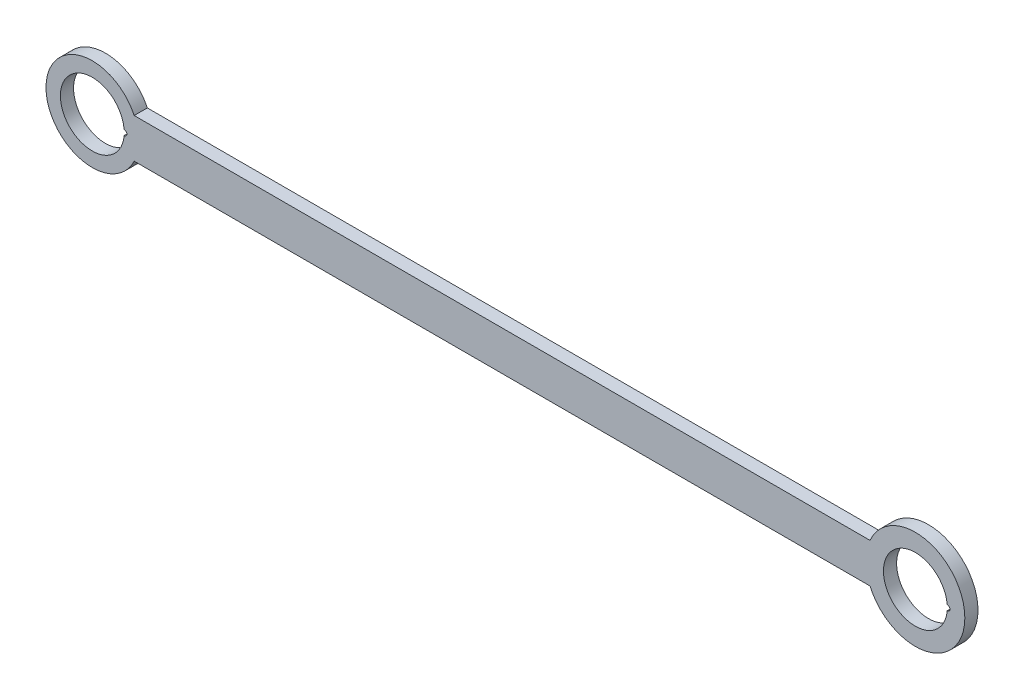
ISO-10303-21;
HEADER;
FILE_DESCRIPTION(('STEP AP214'),'2;1');
FILE_NAME('part.step','',(''),(''),'','','');
FILE_SCHEMA(('AUTOMOTIVE_DESIGN { 1 0 10303 214 1 1 1 1 }'));
ENDSEC;
DATA;
#1=APPLICATION_CONTEXT('core data for automotive mechanical design processes');
#2=APPLICATION_PROTOCOL_DEFINITION('international standard','automotive_design',2000,#1);
#3=PRODUCT_CONTEXT('',#1,'mechanical');
#4=PRODUCT('Part','Part','',(#3));
#5=PRODUCT_RELATED_PRODUCT_CATEGORY('part','',(#4));
#6=PRODUCT_DEFINITION_FORMATION('','',#4);
#7=PRODUCT_DEFINITION_CONTEXT('part definition',#1,'design');
#8=PRODUCT_DEFINITION('design','',#6,#7);
#9=PRODUCT_DEFINITION_SHAPE('','',#8);
#10=(LENGTH_UNIT() NAMED_UNIT(*) SI_UNIT(.MILLI.,.METRE.));
#11=(NAMED_UNIT(*) PLANE_ANGLE_UNIT() SI_UNIT($,.RADIAN.));
#12=(NAMED_UNIT(*) SI_UNIT($,.STERADIAN.) SOLID_ANGLE_UNIT());
#13=UNCERTAINTY_MEASURE_WITH_UNIT(LENGTH_MEASURE(1.E-05),#10,'distance_accuracy_value','');
#14=(GEOMETRIC_REPRESENTATION_CONTEXT(3) GLOBAL_UNCERTAINTY_ASSIGNED_CONTEXT((#13)) GLOBAL_UNIT_ASSIGNED_CONTEXT((#10,
#11,#12)) REPRESENTATION_CONTEXT('',''));
#15=CARTESIAN_POINT('',(0.,0.,0.));
#16=DIRECTION('',(0.,0.,1.));
#17=DIRECTION('',(1.,0.,0.));
#18=AXIS2_PLACEMENT_3D('',#15,#16,#17);
#19=CARTESIAN_POINT('',(0.,0.,4.));
#20=DIRECTION('',(0.,0.,-1.));
#21=DIRECTION('',(-1.,0.,0.));
#22=AXIS2_PLACEMENT_3D('',#19,#20,#21);
#23=PLANE('',#22);
#24=CARTESIAN_POINT('',(0.,0.,4.));
#25=DIRECTION('',(0.,0.,1.));
#26=DIRECTION('',(-1.,0.,0.));
#27=AXIS2_PLACEMENT_3D('',#24,#25,#26);
#28=CIRCLE('',#27,14.0628919691904);
#29=CARTESIAN_POINT('',(12.718684308415,6.,4.));
#30=VERTEX_POINT('',#29);
#31=CARTESIAN_POINT('',(12.718684308415,-6.,4.));
#32=VERTEX_POINT('',#31);
#33=EDGE_CURVE('E137',#30,#32,#28,.T.);
#34=ORIENTED_EDGE('',*,*,#33,.T.);
#35=DIRECTION('',(1.,0.,0.));
#36=VECTOR('',#35,1.);
#37=CARTESIAN_POINT('',(12.718684308415,-6.,4.));
#38=LINE('',#37,#36);
#39=CARTESIAN_POINT('',(236.224480752541,-5.99999999999999,4.));
#40=VERTEX_POINT('',#39);
#41=EDGE_CURVE('E141',#32,#40,#38,.T.);
#42=ORIENTED_EDGE('',*,*,#41,.T.);
#43=CARTESIAN_POINT('',(250.,0.,4.));
#44=DIRECTION('',(0.,0.,1.));
#45=DIRECTION('',(1.,0.,0.));
#46=AXIS2_PLACEMENT_3D('',#43,#44,#45);
#47=CIRCLE('',#46,15.0254760502661);
#48=CARTESIAN_POINT('',(236.224480752541,6.,4.));
#49=VERTEX_POINT('',#48);
#50=EDGE_CURVE('E145',#40,#49,#47,.T.);
#51=ORIENTED_EDGE('',*,*,#50,.T.);
#52=DIRECTION('',(-1.,0.,0.));
#53=VECTOR('',#52,1.);
#54=CARTESIAN_POINT('',(12.718684308415,6.,4.));
#55=LINE('',#54,#53);
#56=EDGE_CURVE('E148',#49,#30,#55,.T.);
#57=ORIENTED_EDGE('',*,*,#56,.T.);
#58=EDGE_LOOP('',(#34,#42,#51,#57));
#59=FACE_BOUND('',#58,.T.);
#60=CARTESIAN_POINT('',(0.,0.,4.));
#61=DIRECTION('',(0.,0.,1.));
#62=DIRECTION('',(1.,0.,0.));
#63=AXIS2_PLACEMENT_3D('',#60,#61,#62);
#64=CIRCLE('',#63,9.7);
#65=CARTESIAN_POINT('',(9.66701030927835,0.799319510775317,4.));
#66=VERTEX_POINT('',#65);
#67=CARTESIAN_POINT('',(9.66701030927835,-0.799319510775317,4.));
#68=VERTEX_POINT('',#67);
#69=EDGE_CURVE('E126',#66,#68,#64,.T.);
#70=ORIENTED_EDGE('',*,*,#69,.F.);
#71=CARTESIAN_POINT('',(9.7,0.,4.));
#72=DIRECTION('',(0.,0.,1.));
#73=DIRECTION('',(1.,0.,0.));
#74=AXIS2_PLACEMENT_3D('',#71,#72,#73);
#75=CIRCLE('',#74,0.800000000000001);
#76=EDGE_CURVE('E54',#68,#66,#75,.T.);
#77=ORIENTED_EDGE('',*,*,#76,.F.);
#78=EDGE_LOOP('',(#70,#77));
#79=FACE_BOUND('',#78,.T.);
#80=CARTESIAN_POINT('',(250.,0.,4.));
#81=DIRECTION('',(0.,0.,1.));
#82=DIRECTION('',(1.,0.,0.));
#83=AXIS2_PLACEMENT_3D('',#80,#81,#82);
#84=CIRCLE('',#83,9.7);
#85=CARTESIAN_POINT('',(259.667010309278,0.799319510775326,4.));
#86=VERTEX_POINT('',#85);
#87=CARTESIAN_POINT('',(259.667010309278,-0.799319510775327,4.));
#88=VERTEX_POINT('',#87);
#89=EDGE_CURVE('E115',#86,#88,#84,.T.);
#90=ORIENTED_EDGE('',*,*,#89,.F.);
#91=CARTESIAN_POINT('',(259.7,0.,4.));
#92=DIRECTION('',(0.,0.,1.));
#93=DIRECTION('',(1.,0.,0.));
#94=AXIS2_PLACEMENT_3D('',#91,#92,#93);
#95=CIRCLE('',#94,0.800000000000011);
#96=EDGE_CURVE('E62',#88,#86,#95,.T.);
#97=ORIENTED_EDGE('',*,*,#96,.F.);
#98=EDGE_LOOP('',(#90,#97));
#99=FACE_BOUND('',#98,.T.);
#100=ADVANCED_FACE('F39',(#59,#79,#99),#23,.F.);
#101=CARTESIAN_POINT('',(0.,0.,0.));
#102=DIRECTION('',(0.,0.,-1.));
#103=DIRECTION('',(-1.,0.,0.));
#104=AXIS2_PLACEMENT_3D('',#101,#102,#103);
#105=PLANE('',#104);
#106=CARTESIAN_POINT('',(9.7,0.,0.));
#107=DIRECTION('',(0.,0.,-1.));
#108=DIRECTION('',(-1.,0.,0.));
#109=AXIS2_PLACEMENT_3D('',#106,#107,#108);
#110=CIRCLE('',#109,0.800000000000001);
#111=CARTESIAN_POINT('',(9.66701030927835,0.799319510775316,0.));
#112=VERTEX_POINT('',#111);
#113=CARTESIAN_POINT('',(9.66701030927835,-0.79931951077531,0.));
#114=VERTEX_POINT('',#113);
#115=EDGE_CURVE('E128',#112,#114,#110,.T.);
#116=ORIENTED_EDGE('',*,*,#115,.F.);
#117=CARTESIAN_POINT('',(0.,0.,0.));
#118=DIRECTION('',(0.,0.,1.));
#119=DIRECTION('',(1.,0.,0.));
#120=AXIS2_PLACEMENT_3D('',#117,#118,#119);
#121=CIRCLE('',#120,9.7);
#122=EDGE_CURVE('E120',#112,#114,#121,.T.);
#123=ORIENTED_EDGE('',*,*,#122,.T.);
#124=EDGE_LOOP('',(#116,#123));
#125=FACE_BOUND('',#124,.T.);
#126=CARTESIAN_POINT('',(259.7,0.,0.));
#127=DIRECTION('',(0.,0.,-1.));
#128=DIRECTION('',(-1.,0.,0.));
#129=AXIS2_PLACEMENT_3D('',#126,#127,#128);
#130=CIRCLE('',#129,0.800000000000011);
#131=CARTESIAN_POINT('',(259.667010309278,0.799319510775328,0.));
#132=VERTEX_POINT('',#131);
#133=CARTESIAN_POINT('',(259.667010309278,-0.799319510775326,0.));
#134=VERTEX_POINT('',#133);
#135=EDGE_CURVE('E105',#132,#134,#130,.T.);
#136=ORIENTED_EDGE('',*,*,#135,.F.);
#137=CARTESIAN_POINT('',(250.,0.,0.));
#138=DIRECTION('',(0.,0.,1.));
#139=DIRECTION('',(1.,0.,0.));
#140=AXIS2_PLACEMENT_3D('',#137,#138,#139);
#141=CIRCLE('',#140,9.7);
#142=EDGE_CURVE('E121',#132,#134,#141,.T.);
#143=ORIENTED_EDGE('',*,*,#142,.T.);
#144=EDGE_LOOP('',(#136,#143));
#145=FACE_BOUND('',#144,.T.);
#146=CARTESIAN_POINT('',(0.,0.,0.));
#147=DIRECTION('',(0.,0.,1.));
#148=DIRECTION('',(-1.,0.,0.));
#149=AXIS2_PLACEMENT_3D('',#146,#147,#148);
#150=CIRCLE('',#149,14.0628919691904);
#151=CARTESIAN_POINT('',(12.718684308415,6.,0.));
#152=VERTEX_POINT('',#151);
#153=CARTESIAN_POINT('',(12.718684308415,-6.,0.));
#154=VERTEX_POINT('',#153);
#155=EDGE_CURVE('E135',#152,#154,#150,.T.);
#156=ORIENTED_EDGE('',*,*,#155,.F.);
#157=DIRECTION('',(-1.,0.,0.));
#158=VECTOR('',#157,1.);
#159=CARTESIAN_POINT('',(12.718684308415,6.,0.));
#160=LINE('',#159,#158);
#161=CARTESIAN_POINT('',(236.224480752541,6.,0.));
#162=VERTEX_POINT('',#161);
#163=EDGE_CURVE('E142',#162,#152,#160,.T.);
#164=ORIENTED_EDGE('',*,*,#163,.F.);
#165=CARTESIAN_POINT('',(250.,0.,0.));
#166=DIRECTION('',(0.,0.,1.));
#167=DIRECTION('',(1.,0.,0.));
#168=AXIS2_PLACEMENT_3D('',#165,#166,#167);
#169=CIRCLE('',#168,15.0254760502661);
#170=CARTESIAN_POINT('',(236.224480752541,-5.99999999999999,0.));
#171=VERTEX_POINT('',#170);
#172=EDGE_CURVE('E158',#171,#162,#169,.T.);
#173=ORIENTED_EDGE('',*,*,#172,.F.);
#174=DIRECTION('',(1.,0.,0.));
#175=VECTOR('',#174,1.);
#176=CARTESIAN_POINT('',(12.718684308415,-6.,0.));
#177=LINE('',#176,#175);
#178=EDGE_CURVE('E155',#154,#171,#177,.T.);
#179=ORIENTED_EDGE('',*,*,#178,.F.);
#180=EDGE_LOOP('',(#156,#164,#173,#179));
#181=FACE_BOUND('',#180,.T.);
#182=ADVANCED_FACE('F187',(#125,#145,#181),#105,.T.);
#183=CARTESIAN_POINT('',(0.,0.,4.));
#184=DIRECTION('',(0.,0.,-1.));
#185=DIRECTION('',(-1.,0.,0.));
#186=AXIS2_PLACEMENT_3D('',#183,#184,#185);
#187=CYLINDRICAL_SURFACE('',#186,14.0628919691904);
#188=ORIENTED_EDGE('',*,*,#155,.T.);
#189=DIRECTION('',(0.,0.,-1.));
#190=VECTOR('',#189,1.);
#191=CARTESIAN_POINT('',(12.718684308415,-6.,4.));
#192=LINE('',#191,#190);
#193=EDGE_CURVE('E174',#32,#154,#192,.T.);
#194=ORIENTED_EDGE('',*,*,#193,.F.);
#195=ORIENTED_EDGE('',*,*,#33,.F.);
#196=DIRECTION('',(0.,0.,-1.));
#197=VECTOR('',#196,1.);
#198=CARTESIAN_POINT('',(12.718684308415,6.,4.));
#199=LINE('',#198,#197);
#200=EDGE_CURVE('E151',#30,#152,#199,.T.);
#201=ORIENTED_EDGE('',*,*,#200,.T.);
#202=EDGE_LOOP('',(#188,#194,#195,#201));
#203=FACE_BOUND('',#202,.T.);
#204=ADVANCED_FACE('F41',(#203),#187,.T.);
#205=CARTESIAN_POINT('',(12.718684308415,-6.,4.));
#206=DIRECTION('',(0.,1.,0.));
#207=DIRECTION('',(0.,0.,1.));
#208=AXIS2_PLACEMENT_3D('',#205,#206,#207);
#209=PLANE('',#208);
#210=ORIENTED_EDGE('',*,*,#178,.T.);
#211=DIRECTION('',(0.,0.,-1.));
#212=VECTOR('',#211,1.);
#213=CARTESIAN_POINT('',(236.224480752541,-5.99999999999999,4.));
#214=LINE('',#213,#212);
#215=EDGE_CURVE('E170',#40,#171,#214,.T.);
#216=ORIENTED_EDGE('',*,*,#215,.F.);
#217=ORIENTED_EDGE('',*,*,#41,.F.);
#218=ORIENTED_EDGE('',*,*,#193,.T.);
#219=EDGE_LOOP('',(#210,#216,#217,#218));
#220=FACE_BOUND('',#219,.T.);
#221=ADVANCED_FACE('F211',(#220),#209,.F.);
#222=CARTESIAN_POINT('',(250.,0.,4.));
#223=DIRECTION('',(0.,0.,-1.));
#224=DIRECTION('',(-1.,0.,0.));
#225=AXIS2_PLACEMENT_3D('',#222,#223,#224);
#226=CYLINDRICAL_SURFACE('',#225,15.0254760502661);
#227=ORIENTED_EDGE('',*,*,#172,.T.);
#228=DIRECTION('',(0.,0.,-1.));
#229=VECTOR('',#228,1.);
#230=CARTESIAN_POINT('',(236.224480752541,6.,4.));
#231=LINE('',#230,#229);
#232=EDGE_CURVE('E166',#49,#162,#231,.T.);
#233=ORIENTED_EDGE('',*,*,#232,.F.);
#234=ORIENTED_EDGE('',*,*,#50,.F.);
#235=ORIENTED_EDGE('',*,*,#215,.T.);
#236=EDGE_LOOP('',(#227,#233,#234,#235));
#237=FACE_BOUND('',#236,.T.);
#238=ADVANCED_FACE('F208',(#237),#226,.T.);
#239=CARTESIAN_POINT('',(12.718684308415,6.,4.));
#240=DIRECTION('',(0.,-1.,0.));
#241=DIRECTION('',(0.,0.,-1.));
#242=AXIS2_PLACEMENT_3D('',#239,#240,#241);
#243=PLANE('',#242);
#244=ORIENTED_EDGE('',*,*,#163,.T.);
#245=ORIENTED_EDGE('',*,*,#200,.F.);
#246=ORIENTED_EDGE('',*,*,#56,.F.);
#247=ORIENTED_EDGE('',*,*,#232,.T.);
#248=EDGE_LOOP('',(#244,#245,#246,#247));
#249=FACE_BOUND('',#248,.T.);
#250=ADVANCED_FACE('F205',(#249),#243,.F.);
#251=CARTESIAN_POINT('',(0.,0.,4.));
#252=DIRECTION('',(0.,0.,-1.));
#253=DIRECTION('',(-1.,0.,0.));
#254=AXIS2_PLACEMENT_3D('',#251,#252,#253);
#255=CYLINDRICAL_SURFACE('',#254,9.7);
#256=DIRECTION('',(0.,0.,1.));
#257=VECTOR('',#256,1.);
#258=CARTESIAN_POINT('',(9.66701030927835,-0.799319510775316,-1.));
#259=LINE('',#258,#257);
#260=EDGE_CURVE('E11',#114,#68,#259,.T.);
#261=ORIENTED_EDGE('',*,*,#260,.F.);
#262=ORIENTED_EDGE('',*,*,#122,.F.);
#263=DIRECTION('',(0.,0.,1.));
#264=VECTOR('',#263,1.);
#265=CARTESIAN_POINT('',(9.66701030927835,0.799319510775316,-1.));
#266=LINE('',#265,#264);
#267=EDGE_CURVE('E48',#66,#112,#266,.F.);
#268=ORIENTED_EDGE('',*,*,#267,.F.);
#269=ORIENTED_EDGE('',*,*,#69,.T.);
#270=EDGE_LOOP('',(#261,#262,#268,#269));
#271=FACE_BOUND('',#270,.T.);
#272=ADVANCED_FACE('F190',(#271),#255,.F.);
#273=CARTESIAN_POINT('',(250.,0.,4.));
#274=DIRECTION('',(0.,0.,-1.));
#275=DIRECTION('',(-1.,0.,0.));
#276=AXIS2_PLACEMENT_3D('',#273,#274,#275);
#277=CYLINDRICAL_SURFACE('',#276,9.7);
#278=DIRECTION('',(0.,0.,1.));
#279=VECTOR('',#278,1.);
#280=CARTESIAN_POINT('',(259.667010309278,-0.799319510775327,-1.));
#281=LINE('',#280,#279);
#282=EDGE_CURVE('E102',#134,#88,#281,.T.);
#283=ORIENTED_EDGE('',*,*,#282,.F.);
#284=ORIENTED_EDGE('',*,*,#142,.F.);
#285=DIRECTION('',(0.,0.,1.));
#286=VECTOR('',#285,1.);
#287=CARTESIAN_POINT('',(259.667010309278,0.799319510775327,-1.));
#288=LINE('',#287,#286);
#289=EDGE_CURVE('E111',#86,#132,#288,.F.);
#290=ORIENTED_EDGE('',*,*,#289,.F.);
#291=ORIENTED_EDGE('',*,*,#89,.T.);
#292=EDGE_LOOP('',(#283,#284,#290,#291));
#293=FACE_BOUND('',#292,.T.);
#294=ADVANCED_FACE('F118',(#293),#277,.F.);
#295=CARTESIAN_POINT('',(259.7,0.,-6.));
#296=DIRECTION('',(0.,0.,1.));
#297=DIRECTION('',(1.,0.,0.));
#298=AXIS2_PLACEMENT_3D('',#295,#296,#297);
#299=CYLINDRICAL_SURFACE('',#298,0.800000000000011);
#300=ORIENTED_EDGE('',*,*,#282,.T.);
#301=ORIENTED_EDGE('',*,*,#96,.T.);
#302=ORIENTED_EDGE('',*,*,#289,.T.);
#303=ORIENTED_EDGE('',*,*,#135,.T.);
#304=EDGE_LOOP('',(#300,#301,#302,#303));
#305=FACE_BOUND('',#304,.T.);
#306=ADVANCED_FACE('F103',(#305),#299,.F.);
#307=CARTESIAN_POINT('',(9.7,0.,-6.));
#308=DIRECTION('',(0.,0.,1.));
#309=DIRECTION('',(1.,0.,0.));
#310=AXIS2_PLACEMENT_3D('',#307,#308,#309);
#311=CYLINDRICAL_SURFACE('',#310,0.800000000000001);
#312=ORIENTED_EDGE('',*,*,#260,.T.);
#313=ORIENTED_EDGE('',*,*,#76,.T.);
#314=ORIENTED_EDGE('',*,*,#267,.T.);
#315=ORIENTED_EDGE('',*,*,#115,.T.);
#316=EDGE_LOOP('',(#312,#313,#314,#315));
#317=FACE_BOUND('',#316,.T.);
#318=ADVANCED_FACE('F181',(#317),#311,.F.);
#319=CLOSED_SHELL('',(#100,#182,#204,#221,#238,#250,#272,#294,#306,#318));
#320=MANIFOLD_SOLID_BREP('B2',#319);
#321=ADVANCED_BREP_SHAPE_REPRESENTATION('',(#18,#320),#14);
#322=SHAPE_DEFINITION_REPRESENTATION(#9,#321);
ENDSEC;
END-ISO-10303-21;
